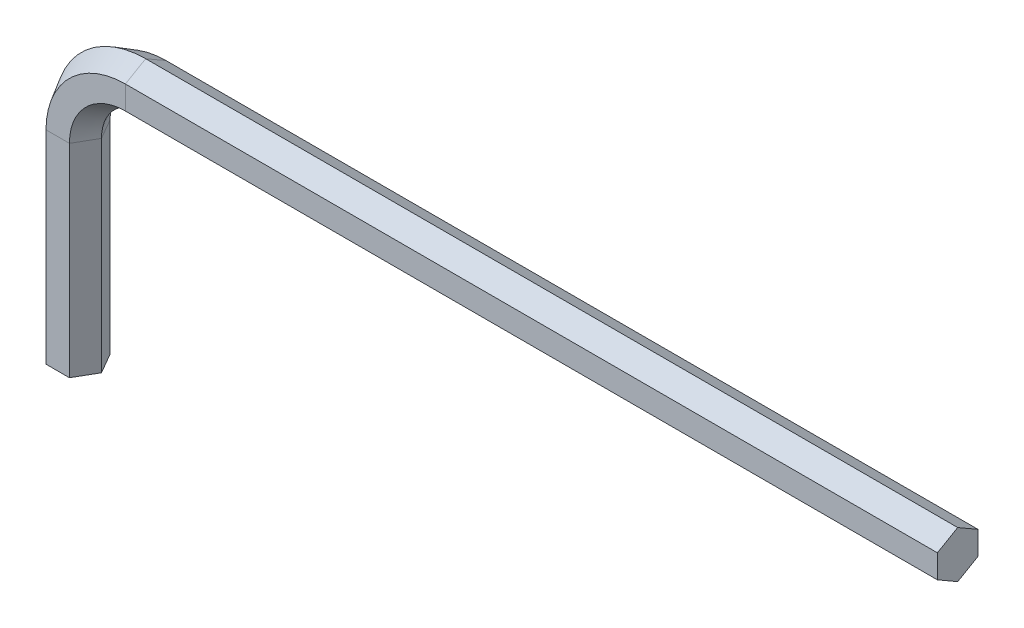
ISO-10303-21;
HEADER;
FILE_DESCRIPTION(('STEP AP214'),'2;1');
FILE_NAME('part.step','',(''),(''),'','','');
FILE_SCHEMA(('AUTOMOTIVE_DESIGN { 1 0 10303 214 1 1 1 1 }'));
ENDSEC;
DATA;
#1=APPLICATION_CONTEXT('core data for automotive mechanical design processes');
#2=APPLICATION_PROTOCOL_DEFINITION('international standard','automotive_design',2000,#1);
#3=PRODUCT_CONTEXT('',#1,'mechanical');
#4=PRODUCT('Part','Part','',(#3));
#5=PRODUCT_RELATED_PRODUCT_CATEGORY('part','',(#4));
#6=PRODUCT_DEFINITION_FORMATION('','',#4);
#7=PRODUCT_DEFINITION_CONTEXT('part definition',#1,'design');
#8=PRODUCT_DEFINITION('design','',#6,#7);
#9=PRODUCT_DEFINITION_SHAPE('','',#8);
#10=(LENGTH_UNIT() NAMED_UNIT(*) SI_UNIT(.MILLI.,.METRE.));
#11=(NAMED_UNIT(*) PLANE_ANGLE_UNIT() SI_UNIT($,.RADIAN.));
#12=(NAMED_UNIT(*) SI_UNIT($,.STERADIAN.) SOLID_ANGLE_UNIT());
#13=UNCERTAINTY_MEASURE_WITH_UNIT(LENGTH_MEASURE(1.E-05),#10,'distance_accuracy_value','');
#14=(GEOMETRIC_REPRESENTATION_CONTEXT(3) GLOBAL_UNCERTAINTY_ASSIGNED_CONTEXT((#13)) GLOBAL_UNIT_ASSIGNED_CONTEXT((#10,
#11,#12)) REPRESENTATION_CONTEXT('',''));
#15=CARTESIAN_POINT('',(0.,0.,0.));
#16=DIRECTION('',(0.,0.,1.));
#17=DIRECTION('',(1.,0.,0.));
#18=AXIS2_PLACEMENT_3D('',#15,#16,#17);
#19=CARTESIAN_POINT('',(0.,0.,0.));
#20=DIRECTION('',(0.,1.,0.));
#21=DIRECTION('',(0.,0.,1.));
#22=AXIS2_PLACEMENT_3D('',#19,#20,#21);
#23=PLANE('',#22);
#24=DIRECTION('',(1.,0.,0.));
#25=VECTOR('',#24,1.);
#26=CARTESIAN_POINT('',(-0.866025403784449,0.,1.50000000000002));
#27=LINE('',#26,#25);
#28=CARTESIAN_POINT('',(-0.866025403784449,0.,1.50000000000002));
#29=VERTEX_POINT('',#28);
#30=CARTESIAN_POINT('',(0.866025403784449,0.,1.50000000000002));
#31=VERTEX_POINT('',#30);
#32=EDGE_CURVE('E194',#29,#31,#27,.T.);
#33=ORIENTED_EDGE('',*,*,#32,.F.);
#34=DIRECTION('',(0.499999999999999,0.,0.866025403784439));
#35=VECTOR('',#34,1.);
#36=CARTESIAN_POINT('',(-1.7320508075689,0.,0.));
#37=LINE('',#36,#35);
#38=CARTESIAN_POINT('',(-1.7320508075689,0.,0.));
#39=VERTEX_POINT('',#38);
#40=EDGE_CURVE('E256',#39,#29,#37,.T.);
#41=ORIENTED_EDGE('',*,*,#40,.F.);
#42=DIRECTION('',(-0.499999999999999,0.,0.866025403784439));
#43=VECTOR('',#42,1.);
#44=CARTESIAN_POINT('',(-0.866025403784447,0.,-1.50000000000002));
#45=LINE('',#44,#43);
#46=CARTESIAN_POINT('',(-0.866025403784447,0.,-1.50000000000002));
#47=VERTEX_POINT('',#46);
#48=EDGE_CURVE('E236',#47,#39,#45,.T.);
#49=ORIENTED_EDGE('',*,*,#48,.F.);
#50=DIRECTION('',(-1.,0.,0.));
#51=VECTOR('',#50,1.);
#52=CARTESIAN_POINT('',(0.86602540378445,0.,-1.50000000000002));
#53=LINE('',#52,#51);
#54=CARTESIAN_POINT('',(0.86602540378445,0.,-1.50000000000002));
#55=VERTEX_POINT('',#54);
#56=EDGE_CURVE('E141',#55,#47,#53,.T.);
#57=ORIENTED_EDGE('',*,*,#56,.F.);
#58=DIRECTION('',(-0.5,0.,-0.866025403784439));
#59=VECTOR('',#58,1.);
#60=CARTESIAN_POINT('',(1.7320508075689,0.,0.));
#61=LINE('',#60,#59);
#62=CARTESIAN_POINT('',(1.7320508075689,0.,0.));
#63=VERTEX_POINT('',#62);
#64=EDGE_CURVE('E145',#63,#55,#61,.T.);
#65=ORIENTED_EDGE('',*,*,#64,.F.);
#66=DIRECTION('',(0.5,0.,-0.866025403784439));
#67=VECTOR('',#66,1.);
#68=CARTESIAN_POINT('',(0.866025403784449,0.,1.50000000000002));
#69=LINE('',#68,#67);
#70=EDGE_CURVE('E150',#31,#63,#69,.T.);
#71=ORIENTED_EDGE('',*,*,#70,.F.);
#72=EDGE_LOOP('',(#33,#41,#49,#57,#65,#71));
#73=FACE_BOUND('',#72,.T.);
#74=ADVANCED_FACE('F39',(#73),#23,.F.);
#75=CARTESIAN_POINT('',(65.,20.,0.));
#76=DIRECTION('',(1.,0.,0.));
#77=DIRECTION('',(0.,0.,1.));
#78=AXIS2_PLACEMENT_3D('',#75,#76,#77);
#79=PLANE('',#78);
#80=DIRECTION('',(0.,-1.,0.));
#81=VECTOR('',#80,1.);
#82=CARTESIAN_POINT('',(65.,20.8660254037845,1.50000000000002));
#83=LINE('',#82,#81);
#84=CARTESIAN_POINT('',(65.,20.8660254037845,1.50000000000002));
#85=VERTEX_POINT('',#84);
#86=CARTESIAN_POINT('',(65.,19.1339745962156,1.50000000000002));
#87=VERTEX_POINT('',#86);
#88=EDGE_CURVE('E161',#85,#87,#83,.T.);
#89=ORIENTED_EDGE('',*,*,#88,.T.);
#90=DIRECTION('',(0.,-0.5,-0.866025403784439));
#91=VECTOR('',#90,1.);
#92=CARTESIAN_POINT('',(65.,19.1339745962156,1.50000000000002));
#93=LINE('',#92,#91);
#94=CARTESIAN_POINT('',(65.,18.2679491924311,0.));
#95=VERTEX_POINT('',#94);
#96=EDGE_CURVE('E164',#87,#95,#93,.T.);
#97=ORIENTED_EDGE('',*,*,#96,.T.);
#98=DIRECTION('',(0.,0.5,-0.866025403784439));
#99=VECTOR('',#98,1.);
#100=CARTESIAN_POINT('',(65.,18.2679491924311,0.));
#101=LINE('',#100,#99);
#102=CARTESIAN_POINT('',(65.,19.1339745962156,-1.50000000000002));
#103=VERTEX_POINT('',#102);
#104=EDGE_CURVE('E214',#95,#103,#101,.T.);
#105=ORIENTED_EDGE('',*,*,#104,.T.);
#106=DIRECTION('',(0.,1.,0.));
#107=VECTOR('',#106,1.);
#108=CARTESIAN_POINT('',(65.,19.1339745962156,-1.50000000000002));
#109=LINE('',#108,#107);
#110=CARTESIAN_POINT('',(65.,20.8660254037844,-1.50000000000002));
#111=VERTEX_POINT('',#110);
#112=EDGE_CURVE('E59',#103,#111,#109,.T.);
#113=ORIENTED_EDGE('',*,*,#112,.T.);
#114=DIRECTION('',(0.,0.499999999999999,0.866025403784439));
#115=VECTOR('',#114,1.);
#116=CARTESIAN_POINT('',(65.,20.8660254037844,-1.50000000000002));
#117=LINE('',#116,#115);
#118=CARTESIAN_POINT('',(65.,21.7320508075689,0.));
#119=VERTEX_POINT('',#118);
#120=EDGE_CURVE('E53',#111,#119,#117,.T.);
#121=ORIENTED_EDGE('',*,*,#120,.T.);
#122=DIRECTION('',(0.,-0.499999999999999,0.866025403784439));
#123=VECTOR('',#122,1.);
#124=CARTESIAN_POINT('',(65.,21.7320508075689,0.));
#125=LINE('',#124,#123);
#126=EDGE_CURVE('E11',#119,#85,#125,.T.);
#127=ORIENTED_EDGE('',*,*,#126,.T.);
#128=EDGE_LOOP('',(#89,#97,#105,#113,#121,#127));
#129=FACE_BOUND('',#128,.T.);
#130=ADVANCED_FACE('F163',(#129),#79,.T.);
#131=CARTESIAN_POINT('',(-0.866025403784449,0.,1.50000000000002));
#132=DIRECTION('',(0.,0.,1.));
#133=DIRECTION('',(1.,0.,0.));
#134=AXIS2_PLACEMENT_3D('',#131,#132,#133);
#135=PLANE('',#134);
#136=DIRECTION('',(0.,1.,0.));
#137=VECTOR('',#136,1.);
#138=CARTESIAN_POINT('',(0.866025403784449,0.,1.50000000000002));
#139=LINE('',#138,#137);
#140=CARTESIAN_POINT('',(0.866025403784449,15.,1.50000000000002));
#141=VERTEX_POINT('',#140);
#142=EDGE_CURVE('E200',#31,#141,#139,.T.);
#143=ORIENTED_EDGE('',*,*,#142,.T.);
#144=DIRECTION('',(1.,0.,0.));
#145=VECTOR('',#144,1.);
#146=CARTESIAN_POINT('',(-0.866025403784449,15.,1.50000000000002));
#147=LINE('',#146,#145);
#148=CARTESIAN_POINT('',(-0.866025403784449,15.,1.50000000000002));
#149=VERTEX_POINT('',#148);
#150=EDGE_CURVE('E301',#149,#141,#147,.T.);
#151=ORIENTED_EDGE('',*,*,#150,.F.);
#152=DIRECTION('',(0.,1.,0.));
#153=VECTOR('',#152,1.);
#154=CARTESIAN_POINT('',(-0.866025403784449,0.,1.50000000000002));
#155=LINE('',#154,#153);
#156=EDGE_CURVE('E277',#29,#149,#155,.T.);
#157=ORIENTED_EDGE('',*,*,#156,.F.);
#158=ORIENTED_EDGE('',*,*,#32,.T.);
#159=EDGE_LOOP('',(#143,#151,#157,#158));
#160=FACE_BOUND('',#159,.T.);
#161=ADVANCED_FACE('F311',(#160),#135,.T.);
#162=CARTESIAN_POINT('',(0.866025403784449,0.,1.50000000000002));
#163=DIRECTION('',(0.866025403784439,0.,0.5));
#164=DIRECTION('',(0.5,0.,-0.866025403784439));
#165=AXIS2_PLACEMENT_3D('',#162,#163,#164);
#166=PLANE('',#165);
#167=DIRECTION('',(0.,1.,0.));
#168=VECTOR('',#167,1.);
#169=CARTESIAN_POINT('',(1.7320508075689,0.,0.));
#170=LINE('',#169,#168);
#171=CARTESIAN_POINT('',(1.7320508075689,15.,0.));
#172=VERTEX_POINT('',#171);
#173=EDGE_CURVE('E199',#63,#172,#170,.T.);
#174=ORIENTED_EDGE('',*,*,#173,.T.);
#175=DIRECTION('',(0.5,0.,-0.866025403784439));
#176=VECTOR('',#175,1.);
#177=CARTESIAN_POINT('',(0.866025403784449,15.,1.50000000000002));
#178=LINE('',#177,#176);
#179=EDGE_CURVE('E195',#141,#172,#178,.T.);
#180=ORIENTED_EDGE('',*,*,#179,.F.);
#181=ORIENTED_EDGE('',*,*,#142,.F.);
#182=ORIENTED_EDGE('',*,*,#70,.T.);
#183=EDGE_LOOP('',(#174,#180,#181,#182));
#184=FACE_BOUND('',#183,.T.);
#185=ADVANCED_FACE('F314',(#184),#166,.T.);
#186=CARTESIAN_POINT('',(1.7320508075689,0.,0.));
#187=DIRECTION('',(0.866025403784439,0.,-0.5));
#188=DIRECTION('',(-0.5,0.,-0.866025403784439));
#189=AXIS2_PLACEMENT_3D('',#186,#187,#188);
#190=PLANE('',#189);
#191=DIRECTION('',(0.,1.,0.));
#192=VECTOR('',#191,1.);
#193=CARTESIAN_POINT('',(0.86602540378445,0.,-1.50000000000002));
#194=LINE('',#193,#192);
#195=CARTESIAN_POINT('',(0.86602540378445,15.,-1.50000000000002));
#196=VERTEX_POINT('',#195);
#197=EDGE_CURVE('E219',#55,#196,#194,.T.);
#198=ORIENTED_EDGE('',*,*,#197,.T.);
#199=DIRECTION('',(-0.5,0.,-0.866025403784439));
#200=VECTOR('',#199,1.);
#201=CARTESIAN_POINT('',(1.7320508075689,15.,0.));
#202=LINE('',#201,#200);
#203=EDGE_CURVE('E204',#172,#196,#202,.T.);
#204=ORIENTED_EDGE('',*,*,#203,.F.);
#205=ORIENTED_EDGE('',*,*,#173,.F.);
#206=ORIENTED_EDGE('',*,*,#64,.T.);
#207=EDGE_LOOP('',(#198,#204,#205,#206));
#208=FACE_BOUND('',#207,.T.);
#209=ADVANCED_FACE('F368',(#208),#190,.T.);
#210=CARTESIAN_POINT('',(0.86602540378445,0.,-1.50000000000002));
#211=DIRECTION('',(0.,0.,-1.));
#212=DIRECTION('',(-1.,0.,0.));
#213=AXIS2_PLACEMENT_3D('',#210,#211,#212);
#214=PLANE('',#213);
#215=DIRECTION('',(0.,1.,0.));
#216=VECTOR('',#215,1.);
#217=CARTESIAN_POINT('',(-0.866025403784447,0.,-1.50000000000002));
#218=LINE('',#217,#216);
#219=CARTESIAN_POINT('',(-0.866025403784447,15.,-1.50000000000002));
#220=VERTEX_POINT('',#219);
#221=EDGE_CURVE('E239',#47,#220,#218,.T.);
#222=ORIENTED_EDGE('',*,*,#221,.T.);
#223=DIRECTION('',(-1.,0.,0.));
#224=VECTOR('',#223,1.);
#225=CARTESIAN_POINT('',(0.86602540378445,15.,-1.50000000000002));
#226=LINE('',#225,#224);
#227=EDGE_CURVE('E223',#196,#220,#226,.T.);
#228=ORIENTED_EDGE('',*,*,#227,.F.);
#229=ORIENTED_EDGE('',*,*,#197,.F.);
#230=ORIENTED_EDGE('',*,*,#56,.T.);
#231=EDGE_LOOP('',(#222,#228,#229,#230));
#232=FACE_BOUND('',#231,.T.);
#233=ADVANCED_FACE('F376',(#232),#214,.T.);
#234=CARTESIAN_POINT('',(-0.866025403784447,0.,-1.50000000000002));
#235=DIRECTION('',(-0.866025403784439,0.,-0.499999999999999));
#236=DIRECTION('',(-0.499999999999999,0.,0.866025403784439));
#237=AXIS2_PLACEMENT_3D('',#234,#235,#236);
#238=PLANE('',#237);
#239=DIRECTION('',(0.,1.,0.));
#240=VECTOR('',#239,1.);
#241=CARTESIAN_POINT('',(-1.7320508075689,0.,0.));
#242=LINE('',#241,#240);
#243=CARTESIAN_POINT('',(-1.7320508075689,15.,0.));
#244=VERTEX_POINT('',#243);
#245=EDGE_CURVE('E259',#39,#244,#242,.T.);
#246=ORIENTED_EDGE('',*,*,#245,.T.);
#247=DIRECTION('',(-0.499999999999999,0.,0.866025403784439));
#248=VECTOR('',#247,1.);
#249=CARTESIAN_POINT('',(-0.866025403784447,15.,-1.50000000000002));
#250=LINE('',#249,#248);
#251=EDGE_CURVE('E243',#220,#244,#250,.T.);
#252=ORIENTED_EDGE('',*,*,#251,.F.);
#253=ORIENTED_EDGE('',*,*,#221,.F.);
#254=ORIENTED_EDGE('',*,*,#48,.T.);
#255=EDGE_LOOP('',(#246,#252,#253,#254));
#256=FACE_BOUND('',#255,.T.);
#257=ADVANCED_FACE('F386',(#256),#238,.T.);
#258=CARTESIAN_POINT('',(-1.7320508075689,0.,0.));
#259=DIRECTION('',(-0.866025403784439,0.,0.499999999999999));
#260=DIRECTION('',(0.499999999999999,0.,0.866025403784439));
#261=AXIS2_PLACEMENT_3D('',#258,#259,#260);
#262=PLANE('',#261);
#263=DIRECTION('',(0.499999999999999,0.,0.866025403784439));
#264=VECTOR('',#263,1.);
#265=CARTESIAN_POINT('',(-1.7320508075689,15.,0.));
#266=LINE('',#265,#264);
#267=EDGE_CURVE('E263',#244,#149,#266,.T.);
#268=ORIENTED_EDGE('',*,*,#267,.F.);
#269=ORIENTED_EDGE('',*,*,#245,.F.);
#270=ORIENTED_EDGE('',*,*,#40,.T.);
#271=ORIENTED_EDGE('',*,*,#156,.T.);
#272=EDGE_LOOP('',(#268,#269,#270,#271));
#273=FACE_BOUND('',#272,.T.);
#274=ADVANCED_FACE('F327',(#273),#262,.T.);
#275=CARTESIAN_POINT('',(-0.866025403784449,15.,1.50000000000002));
#276=DIRECTION('',(0.,0.,1.));
#277=DIRECTION('',(1.,0.,0.));
#278=AXIS2_PLACEMENT_3D('',#275,#276,#277);
#279=PLANE('',#278);
#280=CARTESIAN_POINT('',(5.,15.,1.50000000000002));
#281=DIRECTION('',(0.,0.,-1.));
#282=DIRECTION('',(-1.,0.,0.));
#283=AXIS2_PLACEMENT_3D('',#280,#281,#282);
#284=CIRCLE('',#283,4.13397459621555);
#285=CARTESIAN_POINT('',(5.00000000000003,19.1339745962156,1.50000000000002));
#286=VERTEX_POINT('',#285);
#287=EDGE_CURVE('E208',#141,#286,#284,.T.);
#288=ORIENTED_EDGE('',*,*,#287,.T.);
#289=DIRECTION('',(0.,-1.,0.));
#290=VECTOR('',#289,1.);
#291=CARTESIAN_POINT('',(5.00000000000004,20.8660254037845,1.50000000000002));
#292=LINE('',#291,#290);
#293=CARTESIAN_POINT('',(5.00000000000004,20.8660254037845,1.50000000000002));
#294=VERTEX_POINT('',#293);
#295=EDGE_CURVE('E184',#294,#286,#292,.T.);
#296=ORIENTED_EDGE('',*,*,#295,.F.);
#297=CARTESIAN_POINT('',(5.,15.,1.50000000000002));
#298=DIRECTION('',(0.,0.,-1.));
#299=DIRECTION('',(-1.,0.,0.));
#300=AXIS2_PLACEMENT_3D('',#297,#298,#299);
#301=CIRCLE('',#300,5.86602540378445);
#302=EDGE_CURVE('E280',#149,#294,#301,.T.);
#303=ORIENTED_EDGE('',*,*,#302,.F.);
#304=ORIENTED_EDGE('',*,*,#150,.T.);
#305=EDGE_LOOP('',(#288,#296,#303,#304));
#306=FACE_BOUND('',#305,.T.);
#307=ADVANCED_FACE('F287',(#306),#279,.T.);
#308=CARTESIAN_POINT('',(5.,15.,1.50000000000002));
#309=DIRECTION('',(0.,0.,1.));
#310=DIRECTION('',(1.,0.,0.));
#311=AXIS2_PLACEMENT_3D('',#308,#309,#310);
#312=CONICAL_SURFACE('',#311,4.13397459621555,0.523598775598299);
#313=CARTESIAN_POINT('',(5.,15.,0.));
#314=DIRECTION('',(0.,0.,-1.));
#315=DIRECTION('',(-1.,0.,0.));
#316=AXIS2_PLACEMENT_3D('',#313,#314,#315);
#317=CIRCLE('',#316,3.2679491924311);
#318=CARTESIAN_POINT('',(5.00000000000002,18.2679491924311,0.));
#319=VERTEX_POINT('',#318);
#320=EDGE_CURVE('E128',#172,#319,#317,.T.);
#321=ORIENTED_EDGE('',*,*,#320,.T.);
#322=DIRECTION('',(0.,-0.5,-0.866025403784439));
#323=VECTOR('',#322,1.);
#324=CARTESIAN_POINT('',(5.00000000000003,19.1339745962156,1.50000000000002));
#325=LINE('',#324,#323);
#326=EDGE_CURVE('E205',#286,#319,#325,.T.);
#327=ORIENTED_EDGE('',*,*,#326,.F.);
#328=ORIENTED_EDGE('',*,*,#287,.F.);
#329=ORIENTED_EDGE('',*,*,#179,.T.);
#330=EDGE_LOOP('',(#321,#327,#328,#329));
#331=FACE_BOUND('',#330,.T.);
#332=ADVANCED_FACE('F317',(#331),#312,.F.);
#333=CARTESIAN_POINT('',(5.,15.,0.));
#334=DIRECTION('',(0.,0.,-1.));
#335=DIRECTION('',(-1.,0.,0.));
#336=AXIS2_PLACEMENT_3D('',#333,#334,#335);
#337=CONICAL_SURFACE('',#336,3.2679491924311,0.523598775598298);
#338=CARTESIAN_POINT('',(5.,15.,-1.50000000000002));
#339=DIRECTION('',(0.,0.,-1.));
#340=DIRECTION('',(-1.,0.,0.));
#341=AXIS2_PLACEMENT_3D('',#338,#339,#340);
#342=CIRCLE('',#341,4.13397459621555);
#343=CARTESIAN_POINT('',(5.00000000000003,19.1339745962156,-1.50000000000002));
#344=VERTEX_POINT('',#343);
#345=EDGE_CURVE('E119',#196,#344,#342,.T.);
#346=ORIENTED_EDGE('',*,*,#345,.T.);
#347=DIRECTION('',(0.,0.5,-0.866025403784439));
#348=VECTOR('',#347,1.);
#349=CARTESIAN_POINT('',(5.00000000000002,18.2679491924311,0.));
#350=LINE('',#349,#348);
#351=EDGE_CURVE('E210',#319,#344,#350,.T.);
#352=ORIENTED_EDGE('',*,*,#351,.F.);
#353=ORIENTED_EDGE('',*,*,#320,.F.);
#354=ORIENTED_EDGE('',*,*,#203,.T.);
#355=EDGE_LOOP('',(#346,#352,#353,#354));
#356=FACE_BOUND('',#355,.T.);
#357=ADVANCED_FACE('F319',(#356),#337,.F.);
#358=CARTESIAN_POINT('',(0.86602540378445,15.,-1.50000000000002));
#359=DIRECTION('',(0.,0.,-1.));
#360=DIRECTION('',(-1.,0.,0.));
#361=AXIS2_PLACEMENT_3D('',#358,#359,#360);
#362=PLANE('',#361);
#363=CARTESIAN_POINT('',(5.,15.,-1.50000000000002));
#364=DIRECTION('',(0.,0.,-1.));
#365=DIRECTION('',(-1.,0.,0.));
#366=AXIS2_PLACEMENT_3D('',#363,#364,#365);
#367=CIRCLE('',#366,5.86602540378445);
#368=CARTESIAN_POINT('',(5.00000000000004,20.8660254037844,-1.50000000000002));
#369=VERTEX_POINT('',#368);
#370=EDGE_CURVE('E112',#220,#369,#367,.T.);
#371=ORIENTED_EDGE('',*,*,#370,.T.);
#372=DIRECTION('',(0.,1.,0.));
#373=VECTOR('',#372,1.);
#374=CARTESIAN_POINT('',(5.00000000000003,19.1339745962156,-1.50000000000002));
#375=LINE('',#374,#373);
#376=EDGE_CURVE('E229',#344,#369,#375,.T.);
#377=ORIENTED_EDGE('',*,*,#376,.F.);
#378=ORIENTED_EDGE('',*,*,#345,.F.);
#379=ORIENTED_EDGE('',*,*,#227,.T.);
#380=EDGE_LOOP('',(#371,#377,#378,#379));
#381=FACE_BOUND('',#380,.T.);
#382=ADVANCED_FACE('F325',(#381),#362,.T.);
#383=CARTESIAN_POINT('',(5.,15.,-1.50000000000002));
#384=DIRECTION('',(0.,0.,1.));
#385=DIRECTION('',(1.,0.,0.));
#386=AXIS2_PLACEMENT_3D('',#383,#384,#385);
#387=CONICAL_SURFACE('',#386,5.86602540378445,0.523598775598298);
#388=CARTESIAN_POINT('',(5.,15.,0.));
#389=DIRECTION('',(0.,0.,-1.));
#390=DIRECTION('',(-1.,0.,0.));
#391=AXIS2_PLACEMENT_3D('',#388,#389,#390);
#392=CIRCLE('',#391,6.73205080756889);
#393=CARTESIAN_POINT('',(5.00000000000005,21.7320508075689,0.));
#394=VERTEX_POINT('',#393);
#395=EDGE_CURVE('E266',#244,#394,#392,.T.);
#396=ORIENTED_EDGE('',*,*,#395,.T.);
#397=DIRECTION('',(0.,0.499999999999999,0.866025403784439));
#398=VECTOR('',#397,1.);
#399=CARTESIAN_POINT('',(5.00000000000004,20.8660254037844,-1.50000000000002));
#400=LINE('',#399,#398);
#401=EDGE_CURVE('E248',#369,#394,#400,.T.);
#402=ORIENTED_EDGE('',*,*,#401,.F.);
#403=ORIENTED_EDGE('',*,*,#370,.F.);
#404=ORIENTED_EDGE('',*,*,#251,.T.);
#405=EDGE_LOOP('',(#396,#402,#403,#404));
#406=FACE_BOUND('',#405,.T.);
#407=ADVANCED_FACE('F429',(#406),#387,.T.);
#408=CARTESIAN_POINT('',(5.,15.,0.));
#409=DIRECTION('',(0.,0.,-1.));
#410=DIRECTION('',(-1.,0.,0.));
#411=AXIS2_PLACEMENT_3D('',#408,#409,#410);
#412=CONICAL_SURFACE('',#411,6.73205080756889,0.523598775598298);
#413=DIRECTION('',(0.,-0.499999999999999,0.866025403784439));
#414=VECTOR('',#413,1.);
#415=CARTESIAN_POINT('',(5.00000000000005,21.7320508075689,0.));
#416=LINE('',#415,#414);
#417=EDGE_CURVE('E191',#394,#294,#416,.T.);
#418=ORIENTED_EDGE('',*,*,#417,.F.);
#419=ORIENTED_EDGE('',*,*,#395,.F.);
#420=ORIENTED_EDGE('',*,*,#267,.T.);
#421=ORIENTED_EDGE('',*,*,#302,.T.);
#422=EDGE_LOOP('',(#418,#419,#420,#421));
#423=FACE_BOUND('',#422,.T.);
#424=ADVANCED_FACE('F291',(#423),#412,.T.);
#425=CARTESIAN_POINT('',(5.00000000000004,20.8660254037845,1.50000000000002));
#426=DIRECTION('',(0.,0.,1.));
#427=DIRECTION('',(1.,0.,0.));
#428=AXIS2_PLACEMENT_3D('',#425,#426,#427);
#429=PLANE('',#428);
#430=DIRECTION('',(1.,0.,0.));
#431=VECTOR('',#430,1.);
#432=CARTESIAN_POINT('',(5.00000000000004,19.1339745962156,1.50000000000002));
#433=LINE('',#432,#431);
#434=EDGE_CURVE('E170',#286,#87,#433,.T.);
#435=ORIENTED_EDGE('',*,*,#434,.T.);
#436=ORIENTED_EDGE('',*,*,#88,.F.);
#437=DIRECTION('',(1.,0.,0.));
#438=VECTOR('',#437,1.);
#439=CARTESIAN_POINT('',(5.00000000000004,20.8660254037845,1.50000000000002));
#440=LINE('',#439,#438);
#441=EDGE_CURVE('E171',#294,#85,#440,.T.);
#442=ORIENTED_EDGE('',*,*,#441,.F.);
#443=ORIENTED_EDGE('',*,*,#295,.T.);
#444=EDGE_LOOP('',(#435,#436,#442,#443));
#445=FACE_BOUND('',#444,.T.);
#446=ADVANCED_FACE('F182',(#445),#429,.T.);
#447=CARTESIAN_POINT('',(5.00000000000004,19.1339745962156,1.50000000000002));
#448=DIRECTION('',(0.,-0.866025403784439,0.5));
#449=DIRECTION('',(0.,-0.5,-0.866025403784439));
#450=AXIS2_PLACEMENT_3D('',#447,#448,#449);
#451=PLANE('',#450);
#452=DIRECTION('',(1.,0.,0.));
#453=VECTOR('',#452,1.);
#454=CARTESIAN_POINT('',(5.00000000000004,18.2679491924311,0.));
#455=LINE('',#454,#453);
#456=EDGE_CURVE('E178',#319,#95,#455,.T.);
#457=ORIENTED_EDGE('',*,*,#456,.T.);
#458=ORIENTED_EDGE('',*,*,#96,.F.);
#459=ORIENTED_EDGE('',*,*,#434,.F.);
#460=ORIENTED_EDGE('',*,*,#326,.T.);
#461=EDGE_LOOP('',(#457,#458,#459,#460));
#462=FACE_BOUND('',#461,.T.);
#463=ADVANCED_FACE('F175',(#462),#451,.T.);
#464=CARTESIAN_POINT('',(5.00000000000004,18.2679491924311,0.));
#465=DIRECTION('',(0.,-0.866025403784439,-0.5));
#466=DIRECTION('',(0.,0.5,-0.866025403784439));
#467=AXIS2_PLACEMENT_3D('',#464,#465,#466);
#468=PLANE('',#467);
#469=DIRECTION('',(1.,0.,0.));
#470=VECTOR('',#469,1.);
#471=CARTESIAN_POINT('',(5.00000000000004,19.1339745962156,-1.50000000000002));
#472=LINE('',#471,#470);
#473=EDGE_CURVE('E97',#344,#103,#472,.T.);
#474=ORIENTED_EDGE('',*,*,#473,.T.);
#475=ORIENTED_EDGE('',*,*,#104,.F.);
#476=ORIENTED_EDGE('',*,*,#456,.F.);
#477=ORIENTED_EDGE('',*,*,#351,.T.);
#478=EDGE_LOOP('',(#474,#475,#476,#477));
#479=FACE_BOUND('',#478,.T.);
#480=ADVANCED_FACE('F461',(#479),#468,.T.);
#481=CARTESIAN_POINT('',(5.00000000000004,19.1339745962156,-1.50000000000002));
#482=DIRECTION('',(0.,0.,-1.));
#483=DIRECTION('',(-1.,0.,0.));
#484=AXIS2_PLACEMENT_3D('',#481,#482,#483);
#485=PLANE('',#484);
#486=DIRECTION('',(1.,0.,0.));
#487=VECTOR('',#486,1.);
#488=CARTESIAN_POINT('',(5.00000000000004,20.8660254037844,-1.50000000000002));
#489=LINE('',#488,#487);
#490=EDGE_CURVE('E89',#369,#111,#489,.T.);
#491=ORIENTED_EDGE('',*,*,#490,.T.);
#492=ORIENTED_EDGE('',*,*,#112,.F.);
#493=ORIENTED_EDGE('',*,*,#473,.F.);
#494=ORIENTED_EDGE('',*,*,#376,.T.);
#495=EDGE_LOOP('',(#491,#492,#493,#494));
#496=FACE_BOUND('',#495,.T.);
#497=ADVANCED_FACE('F337',(#496),#485,.T.);
#498=CARTESIAN_POINT('',(5.00000000000004,20.8660254037844,-1.50000000000002));
#499=DIRECTION('',(0.,0.866025403784439,-0.499999999999999));
#500=DIRECTION('',(0.,0.499999999999999,0.866025403784439));
#501=AXIS2_PLACEMENT_3D('',#498,#499,#500);
#502=PLANE('',#501);
#503=DIRECTION('',(1.,0.,0.));
#504=VECTOR('',#503,1.);
#505=CARTESIAN_POINT('',(5.00000000000004,21.7320508075689,0.));
#506=LINE('',#505,#504);
#507=EDGE_CURVE('E47',#394,#119,#506,.T.);
#508=ORIENTED_EDGE('',*,*,#507,.T.);
#509=ORIENTED_EDGE('',*,*,#120,.F.);
#510=ORIENTED_EDGE('',*,*,#490,.F.);
#511=ORIENTED_EDGE('',*,*,#401,.T.);
#512=EDGE_LOOP('',(#508,#509,#510,#511));
#513=FACE_BOUND('',#512,.T.);
#514=ADVANCED_FACE('F332',(#513),#502,.T.);
#515=CARTESIAN_POINT('',(5.00000000000004,21.7320508075689,0.));
#516=DIRECTION('',(0.,0.866025403784439,0.499999999999999));
#517=DIRECTION('',(0.,-0.499999999999999,0.866025403784439));
#518=AXIS2_PLACEMENT_3D('',#515,#516,#517);
#519=PLANE('',#518);
#520=ORIENTED_EDGE('',*,*,#126,.F.);
#521=ORIENTED_EDGE('',*,*,#507,.F.);
#522=ORIENTED_EDGE('',*,*,#417,.T.);
#523=ORIENTED_EDGE('',*,*,#441,.T.);
#524=EDGE_LOOP('',(#520,#521,#522,#523));
#525=FACE_BOUND('',#524,.T.);
#526=ADVANCED_FACE('F282',(#525),#519,.T.);
#527=CLOSED_SHELL('',(#74,#130,#161,#185,#209,#233,#257,#274,#307,#332,#357,#382,#407,#424,#446,
#463,#480,#497,#514,#526));
#528=MANIFOLD_SOLID_BREP('B2',#527);
#529=ADVANCED_BREP_SHAPE_REPRESENTATION('',(#18,#528),#14);
#530=SHAPE_DEFINITION_REPRESENTATION(#9,#529);
ENDSEC;
END-ISO-10303-21;
